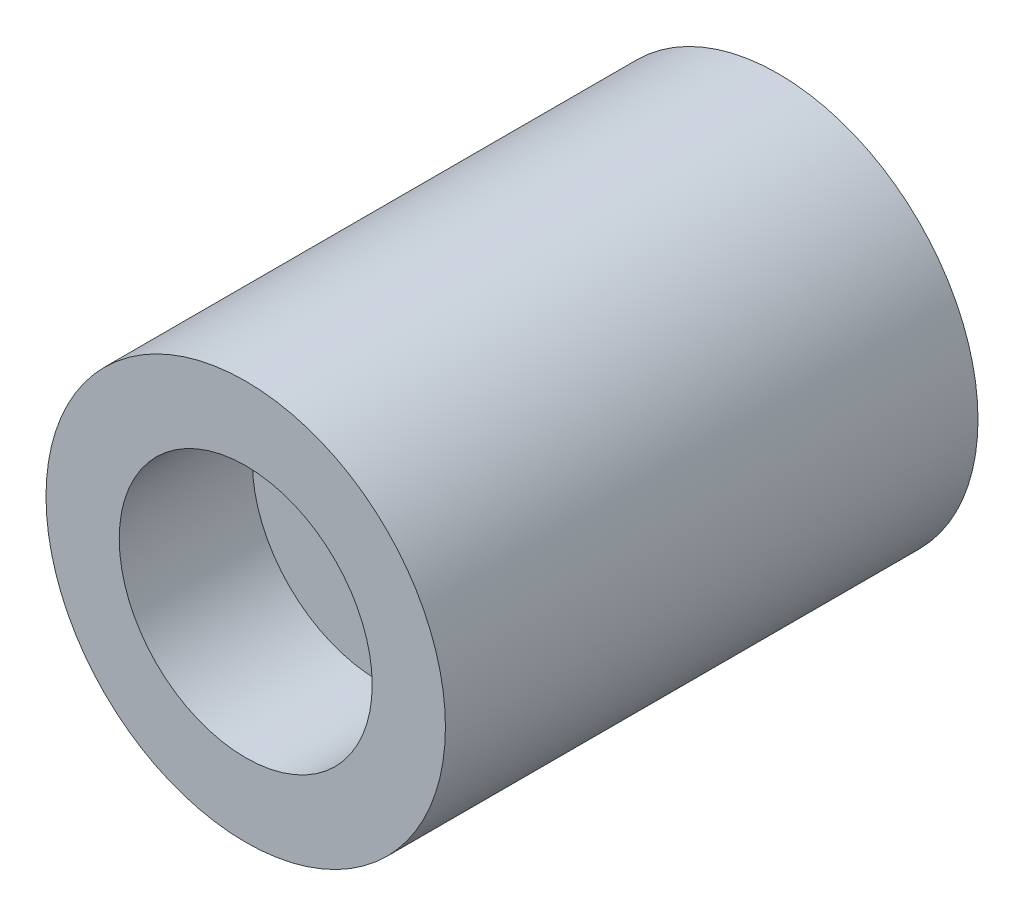
ISO-10303-21;
HEADER;
FILE_DESCRIPTION(('STEP AP214'),'2;1');
FILE_NAME('part.step','',(''),(''),'','','');
FILE_SCHEMA(('AUTOMOTIVE_DESIGN { 1 0 10303 214 1 1 1 1 }'));
ENDSEC;
DATA;
#1=APPLICATION_CONTEXT('core data for automotive mechanical design processes');
#2=APPLICATION_PROTOCOL_DEFINITION('international standard','automotive_design',2000,#1);
#3=PRODUCT_CONTEXT('',#1,'mechanical');
#4=PRODUCT('Part','Part','',(#3));
#5=PRODUCT_RELATED_PRODUCT_CATEGORY('part','',(#4));
#6=PRODUCT_DEFINITION_FORMATION('','',#4);
#7=PRODUCT_DEFINITION_CONTEXT('part definition',#1,'design');
#8=PRODUCT_DEFINITION('design','',#6,#7);
#9=PRODUCT_DEFINITION_SHAPE('','',#8);
#10=(LENGTH_UNIT() NAMED_UNIT(*) SI_UNIT(.MILLI.,.METRE.));
#11=(NAMED_UNIT(*) PLANE_ANGLE_UNIT() SI_UNIT($,.RADIAN.));
#12=(NAMED_UNIT(*) SI_UNIT($,.STERADIAN.) SOLID_ANGLE_UNIT());
#13=UNCERTAINTY_MEASURE_WITH_UNIT(LENGTH_MEASURE(1.E-05),#10,'distance_accuracy_value','');
#14=(GEOMETRIC_REPRESENTATION_CONTEXT(3) GLOBAL_UNCERTAINTY_ASSIGNED_CONTEXT((#13)) GLOBAL_UNIT_ASSIGNED_CONTEXT((#10,
#11,#12)) REPRESENTATION_CONTEXT('',''));
#15=CARTESIAN_POINT('',(0.,0.,0.));
#16=DIRECTION('',(0.,0.,1.));
#17=DIRECTION('',(1.,0.,0.));
#18=AXIS2_PLACEMENT_3D('',#15,#16,#17);
#19=CARTESIAN_POINT('',(0.,0.,8.));
#20=DIRECTION('',(0.,0.,-1.));
#21=DIRECTION('',(-1.,0.,0.));
#22=AXIS2_PLACEMENT_3D('',#19,#20,#21);
#23=CYLINDRICAL_SURFACE('',#22,3.);
#24=CARTESIAN_POINT('',(0.,0.,8.));
#25=DIRECTION('',(0.,0.,1.));
#26=DIRECTION('',(1.,0.,0.));
#27=AXIS2_PLACEMENT_3D('',#24,#25,#26);
#28=CIRCLE('',#27,3.);
#29=CARTESIAN_POINT('',(3.,0.,8.));
#30=VERTEX_POINT('',#29);
#31=EDGE_CURVE('E10',#30,#30,#28,.T.);
#32=ORIENTED_EDGE('',*,*,#31,.F.);
#33=EDGE_LOOP('',(#32));
#34=FACE_BOUND('',#33,.T.);
#35=CARTESIAN_POINT('',(0.,0.,0.));
#36=DIRECTION('',(0.,0.,1.));
#37=DIRECTION('',(1.,0.,0.));
#38=AXIS2_PLACEMENT_3D('',#35,#36,#37);
#39=CIRCLE('',#38,3.);
#40=CARTESIAN_POINT('',(3.,0.,0.));
#41=VERTEX_POINT('',#40);
#42=EDGE_CURVE('E42',#41,#41,#39,.T.);
#43=ORIENTED_EDGE('',*,*,#42,.T.);
#44=EDGE_LOOP('',(#43));
#45=FACE_BOUND('',#44,.T.);
#46=ADVANCED_FACE('F39',(#34,#45),#23,.T.);
#47=CARTESIAN_POINT('',(0.,0.,8.));
#48=DIRECTION('',(0.,0.,1.));
#49=DIRECTION('',(1.,0.,0.));
#50=AXIS2_PLACEMENT_3D('',#47,#48,#49);
#51=PLANE('',#50);
#52=CARTESIAN_POINT('',(0.,0.,8.));
#53=DIRECTION('',(0.,0.,1.));
#54=DIRECTION('',(1.,0.,0.));
#55=AXIS2_PLACEMENT_3D('',#52,#53,#54);
#56=CIRCLE('',#55,1.9);
#57=CARTESIAN_POINT('',(1.9,0.,8.));
#58=VERTEX_POINT('',#57);
#59=EDGE_CURVE('E51',#58,#58,#56,.T.);
#60=ORIENTED_EDGE('',*,*,#59,.F.);
#61=EDGE_LOOP('',(#60));
#62=FACE_BOUND('',#61,.T.);
#63=ORIENTED_EDGE('',*,*,#31,.T.);
#64=EDGE_LOOP('',(#63));
#65=FACE_BOUND('',#64,.T.);
#66=ADVANCED_FACE('F75',(#62,#65),#51,.T.);
#67=CARTESIAN_POINT('',(0.,0.,0.));
#68=DIRECTION('',(0.,0.,1.));
#69=DIRECTION('',(1.,0.,0.));
#70=AXIS2_PLACEMENT_3D('',#67,#68,#69);
#71=PLANE('',#70);
#72=CARTESIAN_POINT('',(0.,0.,0.));
#73=DIRECTION('',(0.,0.,1.));
#74=DIRECTION('',(1.,0.,0.));
#75=AXIS2_PLACEMENT_3D('',#72,#73,#74);
#76=CIRCLE('',#75,1.1);
#77=CARTESIAN_POINT('',(1.1,0.,0.));
#78=VERTEX_POINT('',#77);
#79=EDGE_CURVE('E57',#78,#78,#76,.T.);
#80=ORIENTED_EDGE('',*,*,#79,.T.);
#81=EDGE_LOOP('',(#80));
#82=FACE_BOUND('',#81,.T.);
#83=ORIENTED_EDGE('',*,*,#42,.F.);
#84=EDGE_LOOP('',(#83));
#85=FACE_BOUND('',#84,.T.);
#86=ADVANCED_FACE('F80',(#82,#85),#71,.F.);
#87=CARTESIAN_POINT('',(0.,0.,6.));
#88=DIRECTION('',(0.,0.,1.));
#89=DIRECTION('',(1.,0.,0.));
#90=AXIS2_PLACEMENT_3D('',#87,#88,#89);
#91=CYLINDRICAL_SURFACE('',#90,1.9);
#92=CARTESIAN_POINT('',(0.,0.,6.));
#93=DIRECTION('',(0.,0.,1.));
#94=DIRECTION('',(1.,0.,0.));
#95=AXIS2_PLACEMENT_3D('',#92,#93,#94);
#96=CIRCLE('',#95,1.9);
#97=CARTESIAN_POINT('',(1.9,0.,6.));
#98=VERTEX_POINT('',#97);
#99=EDGE_CURVE('E49',#98,#98,#96,.T.);
#100=ORIENTED_EDGE('',*,*,#99,.F.);
#101=EDGE_LOOP('',(#100));
#102=FACE_BOUND('',#101,.T.);
#103=ORIENTED_EDGE('',*,*,#59,.T.);
#104=EDGE_LOOP('',(#103));
#105=FACE_BOUND('',#104,.T.);
#106=ADVANCED_FACE('F87',(#102,#105),#91,.F.);
#107=CARTESIAN_POINT('',(0.,0.,6.));
#108=DIRECTION('',(0.,0.,1.));
#109=DIRECTION('',(1.,0.,0.));
#110=AXIS2_PLACEMENT_3D('',#107,#108,#109);
#111=PLANE('',#110);
#112=ORIENTED_EDGE('',*,*,#99,.T.);
#113=EDGE_LOOP('',(#112));
#114=FACE_BOUND('',#113,.T.);
#115=ADVANCED_FACE('F72',(#114),#111,.T.);
#116=CARTESIAN_POINT('',(0.,0.,5.));
#117=DIRECTION('',(0.,0.,-1.));
#118=DIRECTION('',(-1.,0.,0.));
#119=AXIS2_PLACEMENT_3D('',#116,#117,#118);
#120=CYLINDRICAL_SURFACE('',#119,1.1);
#121=CARTESIAN_POINT('',(0.,0.,5.));
#122=DIRECTION('',(0.,0.,1.));
#123=DIRECTION('',(1.,0.,0.));
#124=AXIS2_PLACEMENT_3D('',#121,#122,#123);
#125=CIRCLE('',#124,1.1);
#126=CARTESIAN_POINT('',(1.1,0.,5.));
#127=VERTEX_POINT('',#126);
#128=EDGE_CURVE('E54',#127,#127,#125,.T.);
#129=ORIENTED_EDGE('',*,*,#128,.T.);
#130=EDGE_LOOP('',(#129));
#131=FACE_BOUND('',#130,.T.);
#132=ORIENTED_EDGE('',*,*,#79,.F.);
#133=EDGE_LOOP('',(#132));
#134=FACE_BOUND('',#133,.T.);
#135=ADVANCED_FACE('F63',(#131,#134),#120,.F.);
#136=CARTESIAN_POINT('',(0.,0.,5.));
#137=DIRECTION('',(0.,0.,1.));
#138=DIRECTION('',(1.,0.,0.));
#139=AXIS2_PLACEMENT_3D('',#136,#137,#138);
#140=PLANE('',#139);
#141=ORIENTED_EDGE('',*,*,#128,.F.);
#142=EDGE_LOOP('',(#141));
#143=FACE_BOUND('',#142,.T.);
#144=ADVANCED_FACE('F66',(#143),#140,.F.);
#145=CLOSED_SHELL('',(#46,#66,#86,#106,#115,#135,#144));
#146=MANIFOLD_SOLID_BREP('B2',#145);
#147=ADVANCED_BREP_SHAPE_REPRESENTATION('',(#18,#146),#14);
#148=SHAPE_DEFINITION_REPRESENTATION(#9,#147);
ENDSEC;
END-ISO-10303-21;
